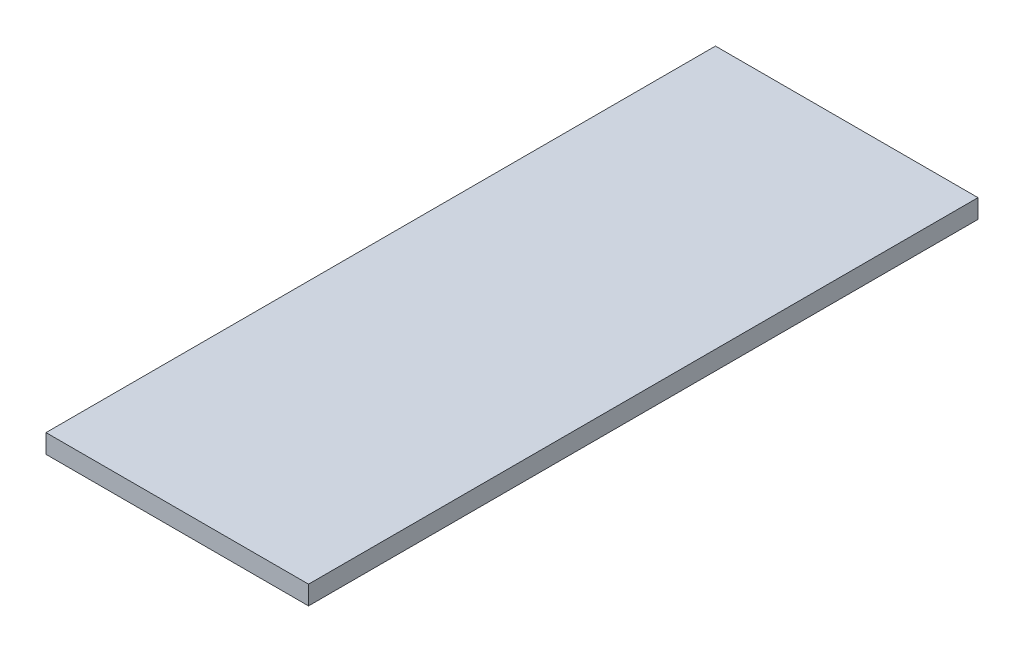
ISO-10303-21;
HEADER;
FILE_DESCRIPTION(('STEP AP214'),'2;1');
FILE_NAME('part.step','',(''),(''),'','','');
FILE_SCHEMA(('AUTOMOTIVE_DESIGN { 1 0 10303 214 1 1 1 1 }'));
ENDSEC;
DATA;
#1=APPLICATION_CONTEXT('core data for automotive mechanical design processes');
#2=APPLICATION_PROTOCOL_DEFINITION('international standard','automotive_design',2000,#1);
#3=PRODUCT_CONTEXT('',#1,'mechanical');
#4=PRODUCT('Part','Part','',(#3));
#5=PRODUCT_RELATED_PRODUCT_CATEGORY('part','',(#4));
#6=PRODUCT_DEFINITION_FORMATION('','',#4);
#7=PRODUCT_DEFINITION_CONTEXT('part definition',#1,'design');
#8=PRODUCT_DEFINITION('design','',#6,#7);
#9=PRODUCT_DEFINITION_SHAPE('','',#8);
#10=(LENGTH_UNIT() NAMED_UNIT(*) SI_UNIT(.MILLI.,.METRE.));
#11=(NAMED_UNIT(*) PLANE_ANGLE_UNIT() SI_UNIT($,.RADIAN.));
#12=(NAMED_UNIT(*) SI_UNIT($,.STERADIAN.) SOLID_ANGLE_UNIT());
#13=UNCERTAINTY_MEASURE_WITH_UNIT(LENGTH_MEASURE(1.E-05),#10,'distance_accuracy_value','');
#14=(GEOMETRIC_REPRESENTATION_CONTEXT(3) GLOBAL_UNCERTAINTY_ASSIGNED_CONTEXT((#13)) GLOBAL_UNIT_ASSIGNED_CONTEXT((#10,
#11,#12)) REPRESENTATION_CONTEXT('',''));
#15=CARTESIAN_POINT('',(0.,0.,0.));
#16=DIRECTION('',(0.,0.,1.));
#17=DIRECTION('',(1.,0.,0.));
#18=AXIS2_PLACEMENT_3D('',#15,#16,#17);
#19=CARTESIAN_POINT('',(-127.,18.25625,209.55));
#20=DIRECTION('',(1.,0.,0.));
#21=DIRECTION('',(0.,0.,-1.));
#22=AXIS2_PLACEMENT_3D('',#19,#20,#21);
#23=PLANE('',#22);
#24=DIRECTION('',(0.,0.,1.));
#25=VECTOR('',#24,1.);
#26=CARTESIAN_POINT('',(-127.,0.,209.55));
#27=LINE('',#26,#25);
#28=CARTESIAN_POINT('',(-127.,0.,-438.15));
#29=VERTEX_POINT('',#28);
#30=CARTESIAN_POINT('',(-127.,0.,209.55));
#31=VERTEX_POINT('',#30);
#32=EDGE_CURVE('E96',#29,#31,#27,.T.);
#33=ORIENTED_EDGE('',*,*,#32,.T.);
#34=DIRECTION('',(0.,-1.,0.));
#35=VECTOR('',#34,1.);
#36=CARTESIAN_POINT('',(-127.,18.25625,209.55));
#37=LINE('',#36,#35);
#38=CARTESIAN_POINT('',(-127.,18.25625,209.55));
#39=VERTEX_POINT('',#38);
#40=EDGE_CURVE('E11',#39,#31,#37,.T.);
#41=ORIENTED_EDGE('',*,*,#40,.F.);
#42=DIRECTION('',(0.,0.,1.));
#43=VECTOR('',#42,1.);
#44=CARTESIAN_POINT('',(-127.,18.25625,209.55));
#45=LINE('',#44,#43);
#46=CARTESIAN_POINT('',(-127.,18.25625,-438.15));
#47=VERTEX_POINT('',#46);
#48=EDGE_CURVE('E84',#47,#39,#45,.T.);
#49=ORIENTED_EDGE('',*,*,#48,.F.);
#50=DIRECTION('',(0.,-1.,0.));
#51=VECTOR('',#50,1.);
#52=CARTESIAN_POINT('',(-127.,18.25625,-438.15));
#53=LINE('',#52,#51);
#54=EDGE_CURVE('E92',#47,#29,#53,.T.);
#55=ORIENTED_EDGE('',*,*,#54,.T.);
#56=EDGE_LOOP('',(#33,#41,#49,#55));
#57=FACE_BOUND('',#56,.T.);
#58=ADVANCED_FACE('F33',(#57),#23,.F.);
#59=CARTESIAN_POINT('',(127.,18.25625,209.55));
#60=DIRECTION('',(0.,0.,-1.));
#61=DIRECTION('',(-1.,0.,0.));
#62=AXIS2_PLACEMENT_3D('',#59,#60,#61);
#63=PLANE('',#62);
#64=DIRECTION('',(1.,0.,0.));
#65=VECTOR('',#64,1.);
#66=CARTESIAN_POINT('',(127.,0.,209.55));
#67=LINE('',#66,#65);
#68=CARTESIAN_POINT('',(127.,0.,209.55));
#69=VERTEX_POINT('',#68);
#70=EDGE_CURVE('E88',#31,#69,#67,.T.);
#71=ORIENTED_EDGE('',*,*,#70,.T.);
#72=DIRECTION('',(0.,-1.,0.));
#73=VECTOR('',#72,1.);
#74=CARTESIAN_POINT('',(127.,18.25625,209.55));
#75=LINE('',#74,#73);
#76=CARTESIAN_POINT('',(127.,18.25625,209.55));
#77=VERTEX_POINT('',#76);
#78=EDGE_CURVE('E41',#77,#69,#75,.T.);
#79=ORIENTED_EDGE('',*,*,#78,.F.);
#80=DIRECTION('',(1.,0.,0.));
#81=VECTOR('',#80,1.);
#82=CARTESIAN_POINT('',(127.,18.25625,209.55));
#83=LINE('',#82,#81);
#84=EDGE_CURVE('E79',#39,#77,#83,.T.);
#85=ORIENTED_EDGE('',*,*,#84,.F.);
#86=ORIENTED_EDGE('',*,*,#40,.T.);
#87=EDGE_LOOP('',(#71,#79,#85,#86));
#88=FACE_BOUND('',#87,.T.);
#89=ADVANCED_FACE('F87',(#88),#63,.F.);
#90=CARTESIAN_POINT('',(127.,18.25625,209.55));
#91=DIRECTION('',(-1.,0.,0.));
#92=DIRECTION('',(0.,0.,1.));
#93=AXIS2_PLACEMENT_3D('',#90,#91,#92);
#94=PLANE('',#93);
#95=DIRECTION('',(0.,0.,-1.));
#96=VECTOR('',#95,1.);
#97=CARTESIAN_POINT('',(127.,0.,209.55));
#98=LINE('',#97,#96);
#99=CARTESIAN_POINT('',(127.,0.,-438.15));
#100=VERTEX_POINT('',#99);
#101=EDGE_CURVE('E66',#69,#100,#98,.T.);
#102=ORIENTED_EDGE('',*,*,#101,.T.);
#103=DIRECTION('',(0.,-1.,0.));
#104=VECTOR('',#103,1.);
#105=CARTESIAN_POINT('',(127.,18.25625,-438.15));
#106=LINE('',#105,#104);
#107=CARTESIAN_POINT('',(127.,18.25625,-438.15));
#108=VERTEX_POINT('',#107);
#109=EDGE_CURVE('E89',#108,#100,#106,.T.);
#110=ORIENTED_EDGE('',*,*,#109,.F.);
#111=DIRECTION('',(0.,0.,-1.));
#112=VECTOR('',#111,1.);
#113=CARTESIAN_POINT('',(127.,18.25625,209.55));
#114=LINE('',#113,#112);
#115=EDGE_CURVE('E82',#77,#108,#114,.T.);
#116=ORIENTED_EDGE('',*,*,#115,.F.);
#117=ORIENTED_EDGE('',*,*,#78,.T.);
#118=EDGE_LOOP('',(#102,#110,#116,#117));
#119=FACE_BOUND('',#118,.T.);
#120=ADVANCED_FACE('F90',(#119),#94,.F.);
#121=CARTESIAN_POINT('',(127.,18.25625,-438.15));
#122=DIRECTION('',(0.,0.,1.));
#123=DIRECTION('',(1.,0.,0.));
#124=AXIS2_PLACEMENT_3D('',#121,#122,#123);
#125=PLANE('',#124);
#126=DIRECTION('',(-1.,0.,0.));
#127=VECTOR('',#126,1.);
#128=CARTESIAN_POINT('',(127.,0.,-438.15));
#129=LINE('',#128,#127);
#130=EDGE_CURVE('E72',#100,#29,#129,.T.);
#131=ORIENTED_EDGE('',*,*,#130,.T.);
#132=ORIENTED_EDGE('',*,*,#54,.F.);
#133=DIRECTION('',(-1.,0.,0.));
#134=VECTOR('',#133,1.);
#135=CARTESIAN_POINT('',(127.,18.25625,-438.15));
#136=LINE('',#135,#134);
#137=EDGE_CURVE('E49',#108,#47,#136,.T.);
#138=ORIENTED_EDGE('',*,*,#137,.F.);
#139=ORIENTED_EDGE('',*,*,#109,.T.);
#140=EDGE_LOOP('',(#131,#132,#138,#139));
#141=FACE_BOUND('',#140,.T.);
#142=ADVANCED_FACE('F103',(#141),#125,.F.);
#143=CARTESIAN_POINT('',(0.,18.25625,0.));
#144=DIRECTION('',(0.,1.,0.));
#145=DIRECTION('',(0.,0.,1.));
#146=AXIS2_PLACEMENT_3D('',#143,#144,#145);
#147=PLANE('',#146);
#148=ORIENTED_EDGE('',*,*,#48,.T.);
#149=ORIENTED_EDGE('',*,*,#84,.T.);
#150=ORIENTED_EDGE('',*,*,#115,.T.);
#151=ORIENTED_EDGE('',*,*,#137,.T.);
#152=EDGE_LOOP('',(#148,#149,#150,#151));
#153=FACE_BOUND('',#152,.T.);
#154=ADVANCED_FACE('F80',(#153),#147,.T.);
#155=CARTESIAN_POINT('',(0.,0.,0.));
#156=DIRECTION('',(0.,1.,0.));
#157=DIRECTION('',(0.,0.,1.));
#158=AXIS2_PLACEMENT_3D('',#155,#156,#157);
#159=PLANE('',#158);
#160=ORIENTED_EDGE('',*,*,#32,.F.);
#161=ORIENTED_EDGE('',*,*,#130,.F.);
#162=ORIENTED_EDGE('',*,*,#101,.F.);
#163=ORIENTED_EDGE('',*,*,#70,.F.);
#164=EDGE_LOOP('',(#160,#161,#162,#163));
#165=FACE_BOUND('',#164,.T.);
#166=ADVANCED_FACE('F106',(#165),#159,.F.);
#167=CLOSED_SHELL('',(#58,#89,#120,#142,#154,#166));
#168=MANIFOLD_SOLID_BREP('B2',#167);
#169=ADVANCED_BREP_SHAPE_REPRESENTATION('',(#18,#168),#14);
#170=SHAPE_DEFINITION_REPRESENTATION(#9,#169);
ENDSEC;
END-ISO-10303-21;
